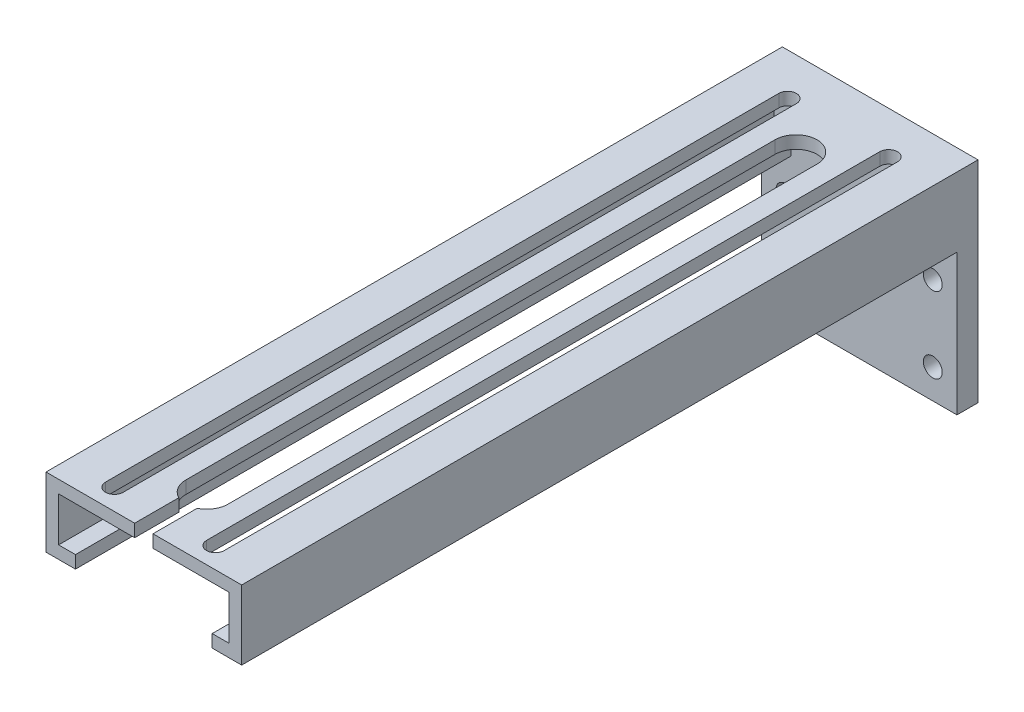
ISO-10303-21;
HEADER;
FILE_DESCRIPTION(('STEP AP214'),'2;1');
FILE_NAME('part.step','',(''),(''),'','','');
FILE_SCHEMA(('AUTOMOTIVE_DESIGN { 1 0 10303 214 1 1 1 1 }'));
ENDSEC;
DATA;
#1=APPLICATION_CONTEXT('core data for automotive mechanical design processes');
#2=APPLICATION_PROTOCOL_DEFINITION('international standard','automotive_design',2000,#1);
#3=PRODUCT_CONTEXT('',#1,'mechanical');
#4=PRODUCT('Part','Part','',(#3));
#5=PRODUCT_RELATED_PRODUCT_CATEGORY('part','',(#4));
#6=PRODUCT_DEFINITION_FORMATION('','',#4);
#7=PRODUCT_DEFINITION_CONTEXT('part definition',#1,'design');
#8=PRODUCT_DEFINITION('design','',#6,#7);
#9=PRODUCT_DEFINITION_SHAPE('','',#8);
#10=(LENGTH_UNIT() NAMED_UNIT(*) SI_UNIT(.MILLI.,.METRE.));
#11=(NAMED_UNIT(*) PLANE_ANGLE_UNIT() SI_UNIT($,.RADIAN.));
#12=(NAMED_UNIT(*) SI_UNIT($,.STERADIAN.) SOLID_ANGLE_UNIT());
#13=UNCERTAINTY_MEASURE_WITH_UNIT(LENGTH_MEASURE(1.E-05),#10,'distance_accuracy_value','');
#14=(GEOMETRIC_REPRESENTATION_CONTEXT(3) GLOBAL_UNCERTAINTY_ASSIGNED_CONTEXT((#13)) GLOBAL_UNIT_ASSIGNED_CONTEXT((#10,
#11,#12)) REPRESENTATION_CONTEXT('',''));
#15=CARTESIAN_POINT('',(0.,0.,0.));
#16=DIRECTION('',(0.,0.,1.));
#17=DIRECTION('',(1.,0.,0.));
#18=AXIS2_PLACEMENT_3D('',#15,#16,#17);
#19=CARTESIAN_POINT('',(0.,0.,175.));
#20=DIRECTION('',(0.,0.,-1.));
#21=DIRECTION('',(-1.,0.,0.));
#22=AXIS2_PLACEMENT_3D('',#19,#20,#21);
#23=PLANE('',#22);
#24=DIRECTION('',(-1.,0.,0.));
#25=VECTOR('',#24,1.);
#26=CARTESIAN_POINT('',(-23.25,25.,175.));
#27=LINE('',#26,#25);
#28=CARTESIAN_POINT('',(23.25,25.,175.));
#29=VERTEX_POINT('',#28);
#30=CARTESIAN_POINT('',(2.17944947177045,25.,175.));
#31=VERTEX_POINT('',#30);
#32=EDGE_CURVE('E327',#29,#31,#27,.T.);
#33=ORIENTED_EDGE('',*,*,#32,.T.);
#34=DIRECTION('',(0.,1.,0.));
#35=VECTOR('',#34,1.);
#36=CARTESIAN_POINT('',(2.17944947177045,20.,175.));
#37=LINE('',#36,#35);
#38=CARTESIAN_POINT('',(2.17944947177045,22.,175.));
#39=VERTEX_POINT('',#38);
#40=EDGE_CURVE('E501',#39,#31,#37,.T.);
#41=ORIENTED_EDGE('',*,*,#40,.F.);
#42=DIRECTION('',(1.,0.,0.));
#43=VECTOR('',#42,1.);
#44=CARTESIAN_POINT('',(20.25,22.,175.));
#45=LINE('',#44,#43);
#46=CARTESIAN_POINT('',(20.25,22.,175.));
#47=VERTEX_POINT('',#46);
#48=EDGE_CURVE('E312',#39,#47,#45,.T.);
#49=ORIENTED_EDGE('',*,*,#48,.T.);
#50=DIRECTION('',(0.,-1.,0.));
#51=VECTOR('',#50,1.);
#52=CARTESIAN_POINT('',(20.25,11.5,175.));
#53=LINE('',#52,#51);
#54=CARTESIAN_POINT('',(20.25,11.5,175.));
#55=VERTEX_POINT('',#54);
#56=EDGE_CURVE('E316',#47,#55,#53,.T.);
#57=ORIENTED_EDGE('',*,*,#56,.T.);
#58=DIRECTION('',(-1.,0.,0.));
#59=VECTOR('',#58,1.);
#60=CARTESIAN_POINT('',(16.25,11.5,175.));
#61=LINE('',#60,#59);
#62=CARTESIAN_POINT('',(16.25,11.5,175.));
#63=VERTEX_POINT('',#62);
#64=EDGE_CURVE('E318',#55,#63,#61,.T.);
#65=ORIENTED_EDGE('',*,*,#64,.T.);
#66=DIRECTION('',(0.,-1.,0.));
#67=VECTOR('',#66,1.);
#68=CARTESIAN_POINT('',(16.25,8.49999999999999,175.));
#69=LINE('',#68,#67);
#70=CARTESIAN_POINT('',(16.25,8.49999999999999,175.));
#71=VERTEX_POINT('',#70);
#72=EDGE_CURVE('E320',#63,#71,#69,.T.);
#73=ORIENTED_EDGE('',*,*,#72,.T.);
#74=DIRECTION('',(1.,0.,0.));
#75=VECTOR('',#74,1.);
#76=CARTESIAN_POINT('',(23.25,8.49999999999999,175.));
#77=LINE('',#76,#75);
#78=CARTESIAN_POINT('',(23.25,8.49999999999999,175.));
#79=VERTEX_POINT('',#78);
#80=EDGE_CURVE('E322',#71,#79,#77,.T.);
#81=ORIENTED_EDGE('',*,*,#80,.T.);
#82=DIRECTION('',(0.,1.,0.));
#83=VECTOR('',#82,1.);
#84=CARTESIAN_POINT('',(23.25,25.,175.));
#85=LINE('',#84,#83);
#86=EDGE_CURVE('E324',#79,#29,#85,.T.);
#87=ORIENTED_EDGE('',*,*,#86,.T.);
#88=EDGE_LOOP('',(#33,#41,#49,#57,#65,#73,#81,#87));
#89=FACE_BOUND('',#88,.T.);
#90=ADVANCED_FACE('F43',(#89),#23,.F.);
#91=CARTESIAN_POINT('',(0.,-25.001,160.));
#92=DIRECTION('',(0.,1.,0.));
#93=DIRECTION('',(-1.,0.,0.));
#94=AXIS2_PLACEMENT_3D('',#91,#92,#93);
#95=CYLINDRICAL_SURFACE('',#94,5.);
#96=CARTESIAN_POINT('',(0.,25.,160.));
#97=DIRECTION('',(0.,1.,0.));
#98=DIRECTION('',(-1.,0.,0.));
#99=AXIS2_PLACEMENT_3D('',#96,#97,#98);
#100=CIRCLE('',#99,5.);
#101=CARTESIAN_POINT('',(-5.,25.,160.));
#102=VERTEX_POINT('',#101);
#103=CARTESIAN_POINT('',(-2.17944947177045,25.,164.5));
#104=VERTEX_POINT('',#103);
#105=EDGE_CURVE('E249',#102,#104,#100,.T.);
#106=ORIENTED_EDGE('',*,*,#105,.T.);
#107=DIRECTION('',(0.,1.,0.));
#108=VECTOR('',#107,1.);
#109=CARTESIAN_POINT('',(-2.17944947177044,-25.001,164.5));
#110=LINE('',#109,#108);
#111=CARTESIAN_POINT('',(-2.17944947177045,22.,164.5));
#112=VERTEX_POINT('',#111);
#113=EDGE_CURVE('E11',#104,#112,#110,.F.);
#114=ORIENTED_EDGE('',*,*,#113,.T.);
#115=CARTESIAN_POINT('',(0.,22.,160.));
#116=DIRECTION('',(0.,1.,0.));
#117=DIRECTION('',(-1.,0.,0.));
#118=AXIS2_PLACEMENT_3D('',#115,#116,#117);
#119=CIRCLE('',#118,5.);
#120=CARTESIAN_POINT('',(-5.,22.,160.));
#121=VERTEX_POINT('',#120);
#122=EDGE_CURVE('E258',#112,#121,#119,.F.);
#123=ORIENTED_EDGE('',*,*,#122,.T.);
#124=DIRECTION('',(0.,1.,0.));
#125=VECTOR('',#124,1.);
#126=CARTESIAN_POINT('',(-5.,-25.001,160.));
#127=LINE('',#126,#125);
#128=EDGE_CURVE('E256',#121,#102,#127,.T.);
#129=ORIENTED_EDGE('',*,*,#128,.T.);
#130=EDGE_LOOP('',(#106,#114,#123,#129));
#131=FACE_BOUND('',#130,.T.);
#132=ADVANCED_FACE('F254',(#131),#95,.F.);
#133=CARTESIAN_POINT('',(-23.25,-25.,5.));
#134=DIRECTION('',(1.,0.,0.));
#135=DIRECTION('',(0.,0.,-1.));
#136=AXIS2_PLACEMENT_3D('',#133,#134,#135);
#137=PLANE('',#136);
#138=DIRECTION('',(0.,-1.,0.));
#139=VECTOR('',#138,1.);
#140=CARTESIAN_POINT('',(-23.25,-25.,0.));
#141=LINE('',#140,#139);
#142=CARTESIAN_POINT('',(-23.25,25.,0.));
#143=VERTEX_POINT('',#142);
#144=CARTESIAN_POINT('',(-23.25,-25.,0.));
#145=VERTEX_POINT('',#144);
#146=EDGE_CURVE('E385',#143,#145,#141,.T.);
#147=ORIENTED_EDGE('',*,*,#146,.T.);
#148=DIRECTION('',(0.,0.,-1.));
#149=VECTOR('',#148,1.);
#150=CARTESIAN_POINT('',(-23.25,-25.,5.));
#151=LINE('',#150,#149);
#152=CARTESIAN_POINT('',(-23.25,-25.,5.));
#153=VERTEX_POINT('',#152);
#154=EDGE_CURVE('E409',#153,#145,#151,.T.);
#155=ORIENTED_EDGE('',*,*,#154,.F.);
#156=DIRECTION('',(0.,-1.,0.));
#157=VECTOR('',#156,1.);
#158=CARTESIAN_POINT('',(-23.25,-25.,5.));
#159=LINE('',#158,#157);
#160=CARTESIAN_POINT('',(-23.25,8.49999999999999,5.));
#161=VERTEX_POINT('',#160);
#162=EDGE_CURVE('E386',#161,#153,#159,.T.);
#163=ORIENTED_EDGE('',*,*,#162,.F.);
#164=DIRECTION('',(0.,0.,-1.));
#165=VECTOR('',#164,1.);
#166=CARTESIAN_POINT('',(-23.25,8.49999999999999,175.));
#167=LINE('',#166,#165);
#168=CARTESIAN_POINT('',(-23.25,8.49999999999999,175.));
#169=VERTEX_POINT('',#168);
#170=EDGE_CURVE('E382',#169,#161,#167,.T.);
#171=ORIENTED_EDGE('',*,*,#170,.F.);
#172=DIRECTION('',(0.,-1.,0.));
#173=VECTOR('',#172,1.);
#174=CARTESIAN_POINT('',(-23.25,8.49999999999999,175.));
#175=LINE('',#174,#173);
#176=CARTESIAN_POINT('',(-23.25,25.,175.));
#177=VERTEX_POINT('',#176);
#178=EDGE_CURVE('E300',#177,#169,#175,.T.);
#179=ORIENTED_EDGE('',*,*,#178,.F.);
#180=DIRECTION('',(0.,0.,-1.));
#181=VECTOR('',#180,1.);
#182=CARTESIAN_POINT('',(-23.25,25.,5.));
#183=LINE('',#182,#181);
#184=EDGE_CURVE('E393',#177,#143,#183,.T.);
#185=ORIENTED_EDGE('',*,*,#184,.T.);
#186=EDGE_LOOP('',(#147,#155,#163,#171,#179,#185));
#187=FACE_BOUND('',#186,.T.);
#188=ADVANCED_FACE('F45',(#187),#137,.F.);
#189=CARTESIAN_POINT('',(23.25,-25.,5.));
#190=DIRECTION('',(0.,1.,0.));
#191=DIRECTION('',(-1.,0.,0.));
#192=AXIS2_PLACEMENT_3D('',#189,#190,#191);
#193=PLANE('',#192);
#194=DIRECTION('',(1.,0.,0.));
#195=VECTOR('',#194,1.);
#196=CARTESIAN_POINT('',(23.25,-25.,0.));
#197=LINE('',#196,#195);
#198=CARTESIAN_POINT('',(23.25,-25.,0.));
#199=VERTEX_POINT('',#198);
#200=EDGE_CURVE('E396',#145,#199,#197,.T.);
#201=ORIENTED_EDGE('',*,*,#200,.T.);
#202=DIRECTION('',(0.,0.,-1.));
#203=VECTOR('',#202,1.);
#204=CARTESIAN_POINT('',(23.25,-25.,5.));
#205=LINE('',#204,#203);
#206=CARTESIAN_POINT('',(23.25,-25.,5.));
#207=VERTEX_POINT('',#206);
#208=EDGE_CURVE('E406',#207,#199,#205,.T.);
#209=ORIENTED_EDGE('',*,*,#208,.F.);
#210=DIRECTION('',(1.,0.,0.));
#211=VECTOR('',#210,1.);
#212=CARTESIAN_POINT('',(23.25,-25.,5.));
#213=LINE('',#212,#211);
#214=EDGE_CURVE('E388',#153,#207,#213,.T.);
#215=ORIENTED_EDGE('',*,*,#214,.F.);
#216=ORIENTED_EDGE('',*,*,#154,.T.);
#217=EDGE_LOOP('',(#201,#209,#215,#216));
#218=FACE_BOUND('',#217,.T.);
#219=ADVANCED_FACE('F619',(#218),#193,.F.);
#220=CARTESIAN_POINT('',(23.25,-25.,5.));
#221=DIRECTION('',(-1.,0.,0.));
#222=DIRECTION('',(0.,0.,1.));
#223=AXIS2_PLACEMENT_3D('',#220,#221,#222);
#224=PLANE('',#223);
#225=DIRECTION('',(0.,1.,0.));
#226=VECTOR('',#225,1.);
#227=CARTESIAN_POINT('',(23.25,-25.,0.));
#228=LINE('',#227,#226);
#229=CARTESIAN_POINT('',(23.25,25.,0.));
#230=VERTEX_POINT('',#229);
#231=EDGE_CURVE('E398',#199,#230,#228,.T.);
#232=ORIENTED_EDGE('',*,*,#231,.T.);
#233=DIRECTION('',(0.,0.,-1.));
#234=VECTOR('',#233,1.);
#235=CARTESIAN_POINT('',(23.25,25.,5.));
#236=LINE('',#235,#234);
#237=EDGE_CURVE('E403',#29,#230,#236,.T.);
#238=ORIENTED_EDGE('',*,*,#237,.F.);
#239=ORIENTED_EDGE('',*,*,#86,.F.);
#240=DIRECTION('',(0.,0.,-1.));
#241=VECTOR('',#240,1.);
#242=CARTESIAN_POINT('',(23.25,8.49999999999999,175.));
#243=LINE('',#242,#241);
#244=CARTESIAN_POINT('',(23.25,8.49999999999999,5.));
#245=VERTEX_POINT('',#244);
#246=EDGE_CURVE('E330',#79,#245,#243,.T.);
#247=ORIENTED_EDGE('',*,*,#246,.T.);
#248=DIRECTION('',(0.,1.,0.));
#249=VECTOR('',#248,1.);
#250=CARTESIAN_POINT('',(23.25,-25.,5.));
#251=LINE('',#250,#249);
#252=EDGE_CURVE('E391',#207,#245,#251,.T.);
#253=ORIENTED_EDGE('',*,*,#252,.F.);
#254=ORIENTED_EDGE('',*,*,#208,.T.);
#255=EDGE_LOOP('',(#232,#238,#239,#247,#253,#254));
#256=FACE_BOUND('',#255,.T.);
#257=ADVANCED_FACE('F616',(#256),#224,.F.);
#258=CARTESIAN_POINT('',(23.25,25.,5.));
#259=DIRECTION('',(0.,-1.,0.));
#260=DIRECTION('',(1.,0.,0.));
#261=AXIS2_PLACEMENT_3D('',#258,#259,#260);
#262=PLANE('',#261);
#263=DIRECTION('',(0.,0.,1.));
#264=VECTOR('',#263,1.);
#265=CARTESIAN_POINT('',(9.9,25.,10.));
#266=LINE('',#265,#264);
#267=CARTESIAN_POINT('',(9.9,25.,10.));
#268=VERTEX_POINT('',#267);
#269=CARTESIAN_POINT('',(9.90000000000001,25.,170.));
#270=VERTEX_POINT('',#269);
#271=EDGE_CURVE('E487',#268,#270,#266,.T.);
#272=ORIENTED_EDGE('',*,*,#271,.F.);
#273=CARTESIAN_POINT('',(12.,25.,10.));
#274=DIRECTION('',(0.,1.,0.));
#275=DIRECTION('',(-1.,0.,0.));
#276=AXIS2_PLACEMENT_3D('',#273,#274,#275);
#277=CIRCLE('',#276,2.1);
#278=CARTESIAN_POINT('',(14.1,25.,10.));
#279=VERTEX_POINT('',#278);
#280=EDGE_CURVE('E490',#279,#268,#277,.T.);
#281=ORIENTED_EDGE('',*,*,#280,.F.);
#282=DIRECTION('',(0.,0.,-1.));
#283=VECTOR('',#282,1.);
#284=CARTESIAN_POINT('',(14.1,25.,10.));
#285=LINE('',#284,#283);
#286=CARTESIAN_POINT('',(14.1,25.,170.));
#287=VERTEX_POINT('',#286);
#288=EDGE_CURVE('E477',#287,#279,#285,.T.);
#289=ORIENTED_EDGE('',*,*,#288,.F.);
#290=CARTESIAN_POINT('',(12.,25.,170.));
#291=DIRECTION('',(0.,1.,0.));
#292=DIRECTION('',(-1.,0.,0.));
#293=AXIS2_PLACEMENT_3D('',#290,#291,#292);
#294=CIRCLE('',#293,2.1);
#295=EDGE_CURVE('E484',#270,#287,#294,.T.);
#296=ORIENTED_EDGE('',*,*,#295,.F.);
#297=EDGE_LOOP('',(#272,#281,#289,#296));
#298=FACE_BOUND('',#297,.T.);
#299=DIRECTION('',(0.,0.,1.));
#300=VECTOR('',#299,1.);
#301=CARTESIAN_POINT('',(-14.1,25.,10.));
#302=LINE('',#301,#300);
#303=CARTESIAN_POINT('',(-14.1,25.,10.));
#304=VERTEX_POINT('',#303);
#305=CARTESIAN_POINT('',(-14.1,25.,170.));
#306=VERTEX_POINT('',#305);
#307=EDGE_CURVE('E450',#304,#306,#302,.T.);
#308=ORIENTED_EDGE('',*,*,#307,.F.);
#309=CARTESIAN_POINT('',(-12.,25.,10.));
#310=DIRECTION('',(0.,1.,0.));
#311=DIRECTION('',(-1.,0.,0.));
#312=AXIS2_PLACEMENT_3D('',#309,#310,#311);
#313=CIRCLE('',#312,2.1);
#314=CARTESIAN_POINT('',(-9.9,25.,10.));
#315=VERTEX_POINT('',#314);
#316=EDGE_CURVE('E448',#315,#304,#313,.T.);
#317=ORIENTED_EDGE('',*,*,#316,.F.);
#318=DIRECTION('',(0.,0.,-1.));
#319=VECTOR('',#318,1.);
#320=CARTESIAN_POINT('',(-9.9,25.,10.));
#321=LINE('',#320,#319);
#322=CARTESIAN_POINT('',(-9.90000000000002,25.,170.));
#323=VERTEX_POINT('',#322);
#324=EDGE_CURVE('E456',#323,#315,#321,.T.);
#325=ORIENTED_EDGE('',*,*,#324,.F.);
#326=CARTESIAN_POINT('',(-12.,25.,170.));
#327=DIRECTION('',(0.,1.,0.));
#328=DIRECTION('',(-1.,0.,0.));
#329=AXIS2_PLACEMENT_3D('',#326,#327,#328);
#330=CIRCLE('',#329,2.1);
#331=EDGE_CURVE('E453',#306,#323,#330,.T.);
#332=ORIENTED_EDGE('',*,*,#331,.F.);
#333=EDGE_LOOP('',(#308,#317,#325,#332));
#334=FACE_BOUND('',#333,.T.);
#335=CARTESIAN_POINT('',(2.17944947177044,25.,164.5));
#336=VERTEX_POINT('',#335);
#337=CARTESIAN_POINT('',(5.,25.,160.));
#338=VERTEX_POINT('',#337);
#339=EDGE_CURVE('E259',#336,#338,#100,.T.);
#340=ORIENTED_EDGE('',*,*,#339,.F.);
#341=DIRECTION('',(0.,0.,-1.));
#342=VECTOR('',#341,1.);
#343=CARTESIAN_POINT('',(2.17944947177045,25.,175.));
#344=LINE('',#343,#342);
#345=EDGE_CURVE('E58',#31,#336,#344,.T.);
#346=ORIENTED_EDGE('',*,*,#345,.F.);
#347=ORIENTED_EDGE('',*,*,#32,.F.);
#348=ORIENTED_EDGE('',*,*,#237,.T.);
#349=DIRECTION('',(-1.,0.,0.));
#350=VECTOR('',#349,1.);
#351=CARTESIAN_POINT('',(23.25,25.,0.));
#352=LINE('',#351,#350);
#353=EDGE_CURVE('E389',#230,#143,#352,.T.);
#354=ORIENTED_EDGE('',*,*,#353,.T.);
#355=ORIENTED_EDGE('',*,*,#184,.F.);
#356=CARTESIAN_POINT('',(-2.17944947177045,25.,175.));
#357=VERTEX_POINT('',#356);
#358=EDGE_CURVE('E251',#357,#177,#27,.T.);
#359=ORIENTED_EDGE('',*,*,#358,.F.);
#360=DIRECTION('',(0.,0.,1.));
#361=VECTOR('',#360,1.);
#362=CARTESIAN_POINT('',(-2.17944947177045,25.,175.));
#363=LINE('',#362,#361);
#364=EDGE_CURVE('E238',#104,#357,#363,.T.);
#365=ORIENTED_EDGE('',*,*,#364,.F.);
#366=ORIENTED_EDGE('',*,*,#105,.F.);
#367=DIRECTION('',(0.,0.,1.));
#368=VECTOR('',#367,1.);
#369=CARTESIAN_POINT('',(-5.,25.,160.));
#370=LINE('',#369,#368);
#371=CARTESIAN_POINT('',(-5.,25.,20.));
#372=VERTEX_POINT('',#371);
#373=EDGE_CURVE('E424',#372,#102,#370,.T.);
#374=ORIENTED_EDGE('',*,*,#373,.F.);
#375=CARTESIAN_POINT('',(0.,25.,20.));
#376=DIRECTION('',(0.,1.,0.));
#377=DIRECTION('',(-1.,0.,0.));
#378=AXIS2_PLACEMENT_3D('',#375,#376,#377);
#379=CIRCLE('',#378,5.);
#380=CARTESIAN_POINT('',(5.,25.,20.));
#381=VERTEX_POINT('',#380);
#382=EDGE_CURVE('E421',#381,#372,#379,.T.);
#383=ORIENTED_EDGE('',*,*,#382,.F.);
#384=DIRECTION('',(0.,0.,-1.));
#385=VECTOR('',#384,1.);
#386=CARTESIAN_POINT('',(5.,25.,160.));
#387=LINE('',#386,#385);
#388=EDGE_CURVE('E263',#338,#381,#387,.T.);
#389=ORIENTED_EDGE('',*,*,#388,.F.);
#390=EDGE_LOOP('',(#340,#346,#347,#348,#354,#355,#359,#365,#366,#374,#383,#389));
#391=FACE_BOUND('',#390,.T.);
#392=ADVANCED_FACE('F247',(#298,#334,#391),#262,.F.);
#393=CARTESIAN_POINT('',(0.,0.,5.));
#394=DIRECTION('',(0.,0.,1.));
#395=DIRECTION('',(1.,0.,0.));
#396=AXIS2_PLACEMENT_3D('',#393,#394,#395);
#397=PLANE('',#396);
#398=CARTESIAN_POINT('',(-17.5,-18.,5.));
#399=DIRECTION('',(0.,0.,1.));
#400=DIRECTION('',(1.,0.,0.));
#401=AXIS2_PLACEMENT_3D('',#398,#399,#400);
#402=CIRCLE('',#401,2.25);
#403=CARTESIAN_POINT('',(-15.25,-18.,5.));
#404=VERTEX_POINT('',#403);
#405=EDGE_CURVE('E274',#404,#404,#402,.T.);
#406=ORIENTED_EDGE('',*,*,#405,.F.);
#407=EDGE_LOOP('',(#406));
#408=FACE_BOUND('',#407,.T.);
#409=CARTESIAN_POINT('',(17.5,0.,5.));
#410=DIRECTION('',(0.,0.,1.));
#411=DIRECTION('',(1.,0.,0.));
#412=AXIS2_PLACEMENT_3D('',#409,#410,#411);
#413=CIRCLE('',#412,2.25);
#414=CARTESIAN_POINT('',(19.75,0.,5.));
#415=VERTEX_POINT('',#414);
#416=EDGE_CURVE('E281',#415,#415,#413,.T.);
#417=ORIENTED_EDGE('',*,*,#416,.F.);
#418=EDGE_LOOP('',(#417));
#419=FACE_BOUND('',#418,.T.);
#420=CARTESIAN_POINT('',(-17.5,0.,5.));
#421=DIRECTION('',(0.,0.,1.));
#422=DIRECTION('',(1.,0.,0.));
#423=AXIS2_PLACEMENT_3D('',#420,#421,#422);
#424=CIRCLE('',#423,2.25);
#425=CARTESIAN_POINT('',(-15.25,0.,5.));
#426=VERTEX_POINT('',#425);
#427=EDGE_CURVE('E287',#426,#426,#424,.T.);
#428=ORIENTED_EDGE('',*,*,#427,.F.);
#429=EDGE_LOOP('',(#428));
#430=FACE_BOUND('',#429,.T.);
#431=CARTESIAN_POINT('',(17.5,-18.,5.));
#432=DIRECTION('',(0.,0.,1.));
#433=DIRECTION('',(1.,0.,0.));
#434=AXIS2_PLACEMENT_3D('',#431,#432,#433);
#435=CIRCLE('',#434,2.25);
#436=CARTESIAN_POINT('',(19.75,-18.,5.));
#437=VERTEX_POINT('',#436);
#438=EDGE_CURVE('E293',#437,#437,#435,.T.);
#439=ORIENTED_EDGE('',*,*,#438,.F.);
#440=EDGE_LOOP('',(#439));
#441=FACE_BOUND('',#440,.T.);
#442=DIRECTION('',(1.,0.,0.));
#443=VECTOR('',#442,1.);
#444=CARTESIAN_POINT('',(23.25,8.49999999999999,5.));
#445=LINE('',#444,#443);
#446=CARTESIAN_POINT('',(16.25,8.49999999999999,5.));
#447=VERTEX_POINT('',#446);
#448=EDGE_CURVE('E304',#447,#245,#445,.T.);
#449=ORIENTED_EDGE('',*,*,#448,.F.);
#450=DIRECTION('',(0.,-1.,0.));
#451=VECTOR('',#450,1.);
#452=CARTESIAN_POINT('',(16.25,8.49999999999999,5.));
#453=LINE('',#452,#451);
#454=CARTESIAN_POINT('',(16.25,11.5,5.));
#455=VERTEX_POINT('',#454);
#456=EDGE_CURVE('E351',#455,#447,#453,.T.);
#457=ORIENTED_EDGE('',*,*,#456,.F.);
#458=DIRECTION('',(-1.,0.,0.));
#459=VECTOR('',#458,1.);
#460=CARTESIAN_POINT('',(16.25,11.5,5.));
#461=LINE('',#460,#459);
#462=CARTESIAN_POINT('',(20.25,11.5,5.));
#463=VERTEX_POINT('',#462);
#464=EDGE_CURVE('E348',#463,#455,#461,.T.);
#465=ORIENTED_EDGE('',*,*,#464,.F.);
#466=DIRECTION('',(0.,-1.,0.));
#467=VECTOR('',#466,1.);
#468=CARTESIAN_POINT('',(20.25,11.5,5.));
#469=LINE('',#468,#467);
#470=CARTESIAN_POINT('',(20.25,22.,5.));
#471=VERTEX_POINT('',#470);
#472=EDGE_CURVE('E345',#471,#463,#469,.T.);
#473=ORIENTED_EDGE('',*,*,#472,.F.);
#474=DIRECTION('',(1.,0.,0.));
#475=VECTOR('',#474,1.);
#476=CARTESIAN_POINT('',(20.25,22.,5.));
#477=LINE('',#476,#475);
#478=CARTESIAN_POINT('',(-20.25,22.,5.));
#479=VERTEX_POINT('',#478);
#480=EDGE_CURVE('E342',#479,#471,#477,.T.);
#481=ORIENTED_EDGE('',*,*,#480,.F.);
#482=DIRECTION('',(0.,1.,0.));
#483=VECTOR('',#482,1.);
#484=CARTESIAN_POINT('',(-20.25,22.,5.));
#485=LINE('',#484,#483);
#486=CARTESIAN_POINT('',(-20.25,11.5,5.));
#487=VERTEX_POINT('',#486);
#488=EDGE_CURVE('E339',#487,#479,#485,.T.);
#489=ORIENTED_EDGE('',*,*,#488,.F.);
#490=DIRECTION('',(-1.,0.,0.));
#491=VECTOR('',#490,1.);
#492=CARTESIAN_POINT('',(-20.25,11.5,5.));
#493=LINE('',#492,#491);
#494=CARTESIAN_POINT('',(-16.25,11.5,5.));
#495=VERTEX_POINT('',#494);
#496=EDGE_CURVE('E336',#495,#487,#493,.T.);
#497=ORIENTED_EDGE('',*,*,#496,.F.);
#498=DIRECTION('',(0.,1.,0.));
#499=VECTOR('',#498,1.);
#500=CARTESIAN_POINT('',(-16.25,11.5,5.));
#501=LINE('',#500,#499);
#502=CARTESIAN_POINT('',(-16.25,8.49999999999999,5.));
#503=VERTEX_POINT('',#502);
#504=EDGE_CURVE('E333',#503,#495,#501,.T.);
#505=ORIENTED_EDGE('',*,*,#504,.F.);
#506=DIRECTION('',(1.,0.,0.));
#507=VECTOR('',#506,1.);
#508=CARTESIAN_POINT('',(-16.25,8.49999999999999,5.));
#509=LINE('',#508,#507);
#510=EDGE_CURVE('E299',#161,#503,#509,.T.);
#511=ORIENTED_EDGE('',*,*,#510,.F.);
#512=ORIENTED_EDGE('',*,*,#162,.T.);
#513=ORIENTED_EDGE('',*,*,#214,.T.);
#514=ORIENTED_EDGE('',*,*,#252,.T.);
#515=EDGE_LOOP('',(#449,#457,#465,#473,#481,#489,#497,#505,#511,#512,#513,#514));
#516=FACE_BOUND('',#515,.T.);
#517=ADVANCED_FACE('F608',(#408,#419,#430,#441,#516),#397,.T.);
#518=CARTESIAN_POINT('',(0.,0.,0.));
#519=DIRECTION('',(0.,0.,1.));
#520=DIRECTION('',(1.,0.,0.));
#521=AXIS2_PLACEMENT_3D('',#518,#519,#520);
#522=PLANE('',#521);
#523=CARTESIAN_POINT('',(-17.5,-18.,0.));
#524=DIRECTION('',(0.,0.,1.));
#525=DIRECTION('',(1.,0.,0.));
#526=AXIS2_PLACEMENT_3D('',#523,#524,#525);
#527=CIRCLE('',#526,2.25);
#528=CARTESIAN_POINT('',(-15.25,-18.,0.));
#529=VERTEX_POINT('',#528);
#530=EDGE_CURVE('E277',#529,#529,#527,.T.);
#531=ORIENTED_EDGE('',*,*,#530,.T.);
#532=EDGE_LOOP('',(#531));
#533=FACE_BOUND('',#532,.T.);
#534=CARTESIAN_POINT('',(17.5,0.,0.));
#535=DIRECTION('',(0.,0.,1.));
#536=DIRECTION('',(1.,0.,0.));
#537=AXIS2_PLACEMENT_3D('',#534,#535,#536);
#538=CIRCLE('',#537,2.25);
#539=CARTESIAN_POINT('',(19.75,0.,0.));
#540=VERTEX_POINT('',#539);
#541=EDGE_CURVE('E284',#540,#540,#538,.T.);
#542=ORIENTED_EDGE('',*,*,#541,.T.);
#543=EDGE_LOOP('',(#542));
#544=FACE_BOUND('',#543,.T.);
#545=CARTESIAN_POINT('',(-17.5,0.,0.));
#546=DIRECTION('',(0.,0.,1.));
#547=DIRECTION('',(1.,0.,0.));
#548=AXIS2_PLACEMENT_3D('',#545,#546,#547);
#549=CIRCLE('',#548,2.25);
#550=CARTESIAN_POINT('',(-15.25,0.,0.));
#551=VERTEX_POINT('',#550);
#552=EDGE_CURVE('E290',#551,#551,#549,.T.);
#553=ORIENTED_EDGE('',*,*,#552,.T.);
#554=EDGE_LOOP('',(#553));
#555=FACE_BOUND('',#554,.T.);
#556=CARTESIAN_POINT('',(17.5,-18.,0.));
#557=DIRECTION('',(0.,0.,1.));
#558=DIRECTION('',(1.,0.,0.));
#559=AXIS2_PLACEMENT_3D('',#556,#557,#558);
#560=CIRCLE('',#559,2.25);
#561=CARTESIAN_POINT('',(19.75,-18.,0.));
#562=VERTEX_POINT('',#561);
#563=EDGE_CURVE('E296',#562,#562,#560,.T.);
#564=ORIENTED_EDGE('',*,*,#563,.T.);
#565=EDGE_LOOP('',(#564));
#566=FACE_BOUND('',#565,.T.);
#567=ORIENTED_EDGE('',*,*,#146,.F.);
#568=ORIENTED_EDGE('',*,*,#353,.F.);
#569=ORIENTED_EDGE('',*,*,#231,.F.);
#570=ORIENTED_EDGE('',*,*,#200,.F.);
#571=EDGE_LOOP('',(#567,#568,#569,#570));
#572=FACE_BOUND('',#571,.T.);
#573=ADVANCED_FACE('F533',(#533,#544,#555,#566,#572),#522,.F.);
#574=CARTESIAN_POINT('',(-16.25,8.49999999999999,175.));
#575=DIRECTION('',(0.,1.,0.));
#576=DIRECTION('',(-1.,0.,0.));
#577=AXIS2_PLACEMENT_3D('',#574,#575,#576);
#578=PLANE('',#577);
#579=ORIENTED_EDGE('',*,*,#510,.T.);
#580=DIRECTION('',(0.,0.,-1.));
#581=VECTOR('',#580,1.);
#582=CARTESIAN_POINT('',(-16.25,8.49999999999999,175.));
#583=LINE('',#582,#581);
#584=CARTESIAN_POINT('',(-16.25,8.49999999999999,175.));
#585=VERTEX_POINT('',#584);
#586=EDGE_CURVE('E379',#585,#503,#583,.T.);
#587=ORIENTED_EDGE('',*,*,#586,.F.);
#588=DIRECTION('',(1.,0.,0.));
#589=VECTOR('',#588,1.);
#590=CARTESIAN_POINT('',(-16.25,8.49999999999999,175.));
#591=LINE('',#590,#589);
#592=EDGE_CURVE('E303',#169,#585,#591,.T.);
#593=ORIENTED_EDGE('',*,*,#592,.F.);
#594=ORIENTED_EDGE('',*,*,#170,.T.);
#595=EDGE_LOOP('',(#579,#587,#593,#594));
#596=FACE_BOUND('',#595,.T.);
#597=ADVANCED_FACE('F603',(#596),#578,.F.);
#598=CARTESIAN_POINT('',(-16.25,11.5,175.));
#599=DIRECTION('',(-1.,0.,0.));
#600=DIRECTION('',(0.,0.,1.));
#601=AXIS2_PLACEMENT_3D('',#598,#599,#600);
#602=PLANE('',#601);
#603=ORIENTED_EDGE('',*,*,#504,.T.);
#604=DIRECTION('',(0.,0.,-1.));
#605=VECTOR('',#604,1.);
#606=CARTESIAN_POINT('',(-16.25,11.5,175.));
#607=LINE('',#606,#605);
#608=CARTESIAN_POINT('',(-16.25,11.5,175.));
#609=VERTEX_POINT('',#608);
#610=EDGE_CURVE('E376',#609,#495,#607,.T.);
#611=ORIENTED_EDGE('',*,*,#610,.F.);
#612=DIRECTION('',(0.,1.,0.));
#613=VECTOR('',#612,1.);
#614=CARTESIAN_POINT('',(-16.25,11.5,175.));
#615=LINE('',#614,#613);
#616=EDGE_CURVE('E306',#585,#609,#615,.T.);
#617=ORIENTED_EDGE('',*,*,#616,.F.);
#618=ORIENTED_EDGE('',*,*,#586,.T.);
#619=EDGE_LOOP('',(#603,#611,#617,#618));
#620=FACE_BOUND('',#619,.T.);
#621=ADVANCED_FACE('F599',(#620),#602,.F.);
#622=CARTESIAN_POINT('',(-20.25,11.5,175.));
#623=DIRECTION('',(0.,-1.,0.));
#624=DIRECTION('',(0.,0.,-1.));
#625=AXIS2_PLACEMENT_3D('',#622,#623,#624);
#626=PLANE('',#625);
#627=ORIENTED_EDGE('',*,*,#496,.T.);
#628=DIRECTION('',(0.,0.,-1.));
#629=VECTOR('',#628,1.);
#630=CARTESIAN_POINT('',(-20.25,11.5,175.));
#631=LINE('',#630,#629);
#632=CARTESIAN_POINT('',(-20.25,11.5,175.));
#633=VERTEX_POINT('',#632);
#634=EDGE_CURVE('E373',#633,#487,#631,.T.);
#635=ORIENTED_EDGE('',*,*,#634,.F.);
#636=DIRECTION('',(-1.,0.,0.));
#637=VECTOR('',#636,1.);
#638=CARTESIAN_POINT('',(-20.25,11.5,175.));
#639=LINE('',#638,#637);
#640=EDGE_CURVE('E308',#609,#633,#639,.T.);
#641=ORIENTED_EDGE('',*,*,#640,.F.);
#642=ORIENTED_EDGE('',*,*,#610,.T.);
#643=EDGE_LOOP('',(#627,#635,#641,#642));
#644=FACE_BOUND('',#643,.T.);
#645=ADVANCED_FACE('F595',(#644),#626,.F.);
#646=CARTESIAN_POINT('',(-20.25,22.,175.));
#647=DIRECTION('',(-1.,0.,0.));
#648=DIRECTION('',(0.,0.,1.));
#649=AXIS2_PLACEMENT_3D('',#646,#647,#648);
#650=PLANE('',#649);
#651=ORIENTED_EDGE('',*,*,#488,.T.);
#652=DIRECTION('',(0.,0.,-1.));
#653=VECTOR('',#652,1.);
#654=CARTESIAN_POINT('',(-20.25,22.,175.));
#655=LINE('',#654,#653);
#656=CARTESIAN_POINT('',(-20.25,22.,175.));
#657=VERTEX_POINT('',#656);
#658=EDGE_CURVE('E370',#657,#479,#655,.T.);
#659=ORIENTED_EDGE('',*,*,#658,.F.);
#660=DIRECTION('',(0.,1.,0.));
#661=VECTOR('',#660,1.);
#662=CARTESIAN_POINT('',(-20.25,22.,175.));
#663=LINE('',#662,#661);
#664=EDGE_CURVE('E310',#633,#657,#663,.T.);
#665=ORIENTED_EDGE('',*,*,#664,.F.);
#666=ORIENTED_EDGE('',*,*,#634,.T.);
#667=EDGE_LOOP('',(#651,#659,#665,#666));
#668=FACE_BOUND('',#667,.T.);
#669=ADVANCED_FACE('F591',(#668),#650,.F.);
#670=CARTESIAN_POINT('',(20.25,22.,175.));
#671=DIRECTION('',(0.,1.,0.));
#672=DIRECTION('',(-1.,0.,0.));
#673=AXIS2_PLACEMENT_3D('',#670,#671,#672);
#674=PLANE('',#673);
#675=DIRECTION('',(0.,0.,1.));
#676=VECTOR('',#675,1.);
#677=CARTESIAN_POINT('',(14.1,22.,10.));
#678=LINE('',#677,#676);
#679=CARTESIAN_POINT('',(14.1,22.,10.));
#680=VERTEX_POINT('',#679);
#681=CARTESIAN_POINT('',(14.1,22.,170.));
#682=VERTEX_POINT('',#681);
#683=EDGE_CURVE('E495',#680,#682,#678,.T.);
#684=ORIENTED_EDGE('',*,*,#683,.F.);
#685=CARTESIAN_POINT('',(12.,22.,10.));
#686=DIRECTION('',(0.,1.,0.));
#687=DIRECTION('',(-1.,0.,0.));
#688=AXIS2_PLACEMENT_3D('',#685,#686,#687);
#689=CIRCLE('',#688,2.1);
#690=CARTESIAN_POINT('',(9.9,22.,10.));
#691=VERTEX_POINT('',#690);
#692=EDGE_CURVE('E492',#691,#680,#689,.F.);
#693=ORIENTED_EDGE('',*,*,#692,.F.);
#694=DIRECTION('',(0.,0.,-1.));
#695=VECTOR('',#694,1.);
#696=CARTESIAN_POINT('',(9.9,22.,10.));
#697=LINE('',#696,#695);
#698=CARTESIAN_POINT('',(9.90000000000002,22.,170.));
#699=VERTEX_POINT('',#698);
#700=EDGE_CURVE('E278',#699,#691,#697,.T.);
#701=ORIENTED_EDGE('',*,*,#700,.F.);
#702=CARTESIAN_POINT('',(12.,22.,170.));
#703=DIRECTION('',(0.,1.,0.));
#704=DIRECTION('',(-1.,0.,0.));
#705=AXIS2_PLACEMENT_3D('',#702,#703,#704);
#706=CIRCLE('',#705,2.1);
#707=EDGE_CURVE('E441',#682,#699,#706,.F.);
#708=ORIENTED_EDGE('',*,*,#707,.F.);
#709=EDGE_LOOP('',(#684,#693,#701,#708));
#710=FACE_BOUND('',#709,.T.);
#711=DIRECTION('',(0.,0.,1.));
#712=VECTOR('',#711,1.);
#713=CARTESIAN_POINT('',(-9.9,22.,10.));
#714=LINE('',#713,#712);
#715=CARTESIAN_POINT('',(-9.9,22.,10.));
#716=VERTEX_POINT('',#715);
#717=CARTESIAN_POINT('',(-9.90000000000002,22.,170.));
#718=VERTEX_POINT('',#717);
#719=EDGE_CURVE('E442',#716,#718,#714,.T.);
#720=ORIENTED_EDGE('',*,*,#719,.F.);
#721=CARTESIAN_POINT('',(-12.,22.,10.));
#722=DIRECTION('',(0.,1.,0.));
#723=DIRECTION('',(-1.,0.,0.));
#724=AXIS2_PLACEMENT_3D('',#721,#722,#723);
#725=CIRCLE('',#724,2.1);
#726=CARTESIAN_POINT('',(-14.1,22.,10.));
#727=VERTEX_POINT('',#726);
#728=EDGE_CURVE('E445',#727,#716,#725,.F.);
#729=ORIENTED_EDGE('',*,*,#728,.F.);
#730=DIRECTION('',(0.,0.,-1.));
#731=VECTOR('',#730,1.);
#732=CARTESIAN_POINT('',(-14.1,22.,10.));
#733=LINE('',#732,#731);
#734=CARTESIAN_POINT('',(-14.1,22.,170.));
#735=VERTEX_POINT('',#734);
#736=EDGE_CURVE('E273',#735,#727,#733,.T.);
#737=ORIENTED_EDGE('',*,*,#736,.F.);
#738=CARTESIAN_POINT('',(-12.,22.,170.));
#739=DIRECTION('',(0.,1.,0.));
#740=DIRECTION('',(-1.,0.,0.));
#741=AXIS2_PLACEMENT_3D('',#738,#739,#740);
#742=CIRCLE('',#741,2.1);
#743=EDGE_CURVE('E439',#718,#735,#742,.F.);
#744=ORIENTED_EDGE('',*,*,#743,.F.);
#745=EDGE_LOOP('',(#720,#729,#737,#744));
#746=FACE_BOUND('',#745,.T.);
#747=ORIENTED_EDGE('',*,*,#48,.F.);
#748=DIRECTION('',(0.,0.,-1.));
#749=VECTOR('',#748,1.);
#750=CARTESIAN_POINT('',(2.17944947177045,22.,175.));
#751=LINE('',#750,#749);
#752=CARTESIAN_POINT('',(2.17944947177045,22.,164.5));
#753=VERTEX_POINT('',#752);
#754=EDGE_CURVE('E438',#39,#753,#751,.T.);
#755=ORIENTED_EDGE('',*,*,#754,.T.);
#756=CARTESIAN_POINT('',(5.,22.,160.));
#757=VERTEX_POINT('',#756);
#758=EDGE_CURVE('E261',#757,#753,#119,.F.);
#759=ORIENTED_EDGE('',*,*,#758,.F.);
#760=DIRECTION('',(0.,0.,1.));
#761=VECTOR('',#760,1.);
#762=CARTESIAN_POINT('',(5.,22.,160.));
#763=LINE('',#762,#761);
#764=CARTESIAN_POINT('',(5.,22.,20.));
#765=VERTEX_POINT('',#764);
#766=EDGE_CURVE('E431',#765,#757,#763,.T.);
#767=ORIENTED_EDGE('',*,*,#766,.F.);
#768=CARTESIAN_POINT('',(0.,22.,20.));
#769=DIRECTION('',(0.,1.,0.));
#770=DIRECTION('',(-1.,0.,0.));
#771=AXIS2_PLACEMENT_3D('',#768,#769,#770);
#772=CIRCLE('',#771,5.);
#773=CARTESIAN_POINT('',(-5.,22.,20.));
#774=VERTEX_POINT('',#773);
#775=EDGE_CURVE('E271',#774,#765,#772,.F.);
#776=ORIENTED_EDGE('',*,*,#775,.F.);
#777=DIRECTION('',(0.,0.,-1.));
#778=VECTOR('',#777,1.);
#779=CARTESIAN_POINT('',(-5.,22.,160.));
#780=LINE('',#779,#778);
#781=EDGE_CURVE('E268',#121,#774,#780,.T.);
#782=ORIENTED_EDGE('',*,*,#781,.F.);
#783=ORIENTED_EDGE('',*,*,#122,.F.);
#784=DIRECTION('',(0.,0.,1.));
#785=VECTOR('',#784,1.);
#786=CARTESIAN_POINT('',(-2.17944947177045,22.,175.));
#787=LINE('',#786,#785);
#788=CARTESIAN_POINT('',(-2.17944947177045,22.,175.));
#789=VERTEX_POINT('',#788);
#790=EDGE_CURVE('E66',#112,#789,#787,.T.);
#791=ORIENTED_EDGE('',*,*,#790,.T.);
#792=EDGE_CURVE('E313',#657,#789,#45,.T.);
#793=ORIENTED_EDGE('',*,*,#792,.F.);
#794=ORIENTED_EDGE('',*,*,#658,.T.);
#795=ORIENTED_EDGE('',*,*,#480,.T.);
#796=DIRECTION('',(0.,0.,-1.));
#797=VECTOR('',#796,1.);
#798=CARTESIAN_POINT('',(20.25,22.,175.));
#799=LINE('',#798,#797);
#800=EDGE_CURVE('E367',#47,#471,#799,.T.);
#801=ORIENTED_EDGE('',*,*,#800,.F.);
#802=EDGE_LOOP('',(#747,#755,#759,#767,#776,#782,#783,#791,#793,#794,#795,#801));
#803=FACE_BOUND('',#802,.T.);
#804=ADVANCED_FACE('F510',(#710,#746,#803),#674,.F.);
#805=CARTESIAN_POINT('',(20.25,11.5,175.));
#806=DIRECTION('',(1.,0.,0.));
#807=DIRECTION('',(0.,0.,-1.));
#808=AXIS2_PLACEMENT_3D('',#805,#806,#807);
#809=PLANE('',#808);
#810=ORIENTED_EDGE('',*,*,#472,.T.);
#811=DIRECTION('',(0.,0.,-1.));
#812=VECTOR('',#811,1.);
#813=CARTESIAN_POINT('',(20.25,11.5,175.));
#814=LINE('',#813,#812);
#815=EDGE_CURVE('E364',#55,#463,#814,.T.);
#816=ORIENTED_EDGE('',*,*,#815,.F.);
#817=ORIENTED_EDGE('',*,*,#56,.F.);
#818=ORIENTED_EDGE('',*,*,#800,.T.);
#819=EDGE_LOOP('',(#810,#816,#817,#818));
#820=FACE_BOUND('',#819,.T.);
#821=ADVANCED_FACE('F514',(#820),#809,.F.);
#822=CARTESIAN_POINT('',(16.25,11.5,175.));
#823=DIRECTION('',(0.,-1.,0.));
#824=DIRECTION('',(0.,0.,-1.));
#825=AXIS2_PLACEMENT_3D('',#822,#823,#824);
#826=PLANE('',#825);
#827=ORIENTED_EDGE('',*,*,#464,.T.);
#828=DIRECTION('',(0.,0.,-1.));
#829=VECTOR('',#828,1.);
#830=CARTESIAN_POINT('',(16.25,11.5,175.));
#831=LINE('',#830,#829);
#832=EDGE_CURVE('E361',#63,#455,#831,.T.);
#833=ORIENTED_EDGE('',*,*,#832,.F.);
#834=ORIENTED_EDGE('',*,*,#64,.F.);
#835=ORIENTED_EDGE('',*,*,#815,.T.);
#836=EDGE_LOOP('',(#827,#833,#834,#835));
#837=FACE_BOUND('',#836,.T.);
#838=ADVANCED_FACE('F520',(#837),#826,.F.);
#839=CARTESIAN_POINT('',(16.25,8.49999999999999,175.));
#840=DIRECTION('',(1.,0.,0.));
#841=DIRECTION('',(0.,0.,-1.));
#842=AXIS2_PLACEMENT_3D('',#839,#840,#841);
#843=PLANE('',#842);
#844=ORIENTED_EDGE('',*,*,#456,.T.);
#845=DIRECTION('',(0.,0.,-1.));
#846=VECTOR('',#845,1.);
#847=CARTESIAN_POINT('',(16.25,8.49999999999999,175.));
#848=LINE('',#847,#846);
#849=EDGE_CURVE('E358',#71,#447,#848,.T.);
#850=ORIENTED_EDGE('',*,*,#849,.F.);
#851=ORIENTED_EDGE('',*,*,#72,.F.);
#852=ORIENTED_EDGE('',*,*,#832,.T.);
#853=EDGE_LOOP('',(#844,#850,#851,#852));
#854=FACE_BOUND('',#853,.T.);
#855=ADVANCED_FACE('F522',(#854),#843,.F.);
#856=CARTESIAN_POINT('',(23.25,8.49999999999999,175.));
#857=DIRECTION('',(0.,1.,0.));
#858=DIRECTION('',(-1.,0.,0.));
#859=AXIS2_PLACEMENT_3D('',#856,#857,#858);
#860=PLANE('',#859);
#861=ORIENTED_EDGE('',*,*,#448,.T.);
#862=ORIENTED_EDGE('',*,*,#246,.F.);
#863=ORIENTED_EDGE('',*,*,#80,.F.);
#864=ORIENTED_EDGE('',*,*,#849,.T.);
#865=EDGE_LOOP('',(#861,#862,#863,#864));
#866=FACE_BOUND('',#865,.T.);
#867=ADVANCED_FACE('F526',(#866),#860,.F.);
#868=ORIENTED_EDGE('',*,*,#792,.T.);
#869=DIRECTION('',(0.,1.,0.));
#870=VECTOR('',#869,1.);
#871=CARTESIAN_POINT('',(-2.17944947177045,20.,175.));
#872=LINE('',#871,#870);
#873=EDGE_CURVE('E252',#789,#357,#872,.T.);
#874=ORIENTED_EDGE('',*,*,#873,.T.);
#875=ORIENTED_EDGE('',*,*,#358,.T.);
#876=ORIENTED_EDGE('',*,*,#178,.T.);
#877=ORIENTED_EDGE('',*,*,#592,.T.);
#878=ORIENTED_EDGE('',*,*,#616,.T.);
#879=ORIENTED_EDGE('',*,*,#640,.T.);
#880=ORIENTED_EDGE('',*,*,#664,.T.);
#881=EDGE_LOOP('',(#868,#874,#875,#876,#877,#878,#879,#880));
#882=FACE_BOUND('',#881,.T.);
#883=ADVANCED_FACE('F540',(#882),#23,.F.);
#884=CARTESIAN_POINT('',(17.5,-18.,5.));
#885=DIRECTION('',(0.,0.,1.));
#886=DIRECTION('',(1.,0.,0.));
#887=AXIS2_PLACEMENT_3D('',#884,#885,#886);
#888=CYLINDRICAL_SURFACE('',#887,2.25);
#889=ORIENTED_EDGE('',*,*,#563,.F.);
#890=EDGE_LOOP('',(#889));
#891=FACE_BOUND('',#890,.T.);
#892=ORIENTED_EDGE('',*,*,#438,.T.);
#893=EDGE_LOOP('',(#892));
#894=FACE_BOUND('',#893,.T.);
#895=ADVANCED_FACE('F571',(#891,#894),#888,.F.);
#896=CARTESIAN_POINT('',(-17.5,0.,5.));
#897=DIRECTION('',(0.,0.,1.));
#898=DIRECTION('',(1.,0.,0.));
#899=AXIS2_PLACEMENT_3D('',#896,#897,#898);
#900=CYLINDRICAL_SURFACE('',#899,2.25);
#901=ORIENTED_EDGE('',*,*,#552,.F.);
#902=EDGE_LOOP('',(#901));
#903=FACE_BOUND('',#902,.T.);
#904=ORIENTED_EDGE('',*,*,#427,.T.);
#905=EDGE_LOOP('',(#904));
#906=FACE_BOUND('',#905,.T.);
#907=ADVANCED_FACE('F577',(#903,#906),#900,.F.);
#908=CARTESIAN_POINT('',(17.5,0.,5.));
#909=DIRECTION('',(0.,0.,1.));
#910=DIRECTION('',(1.,0.,0.));
#911=AXIS2_PLACEMENT_3D('',#908,#909,#910);
#912=CYLINDRICAL_SURFACE('',#911,2.25);
#913=ORIENTED_EDGE('',*,*,#541,.F.);
#914=EDGE_LOOP('',(#913));
#915=FACE_BOUND('',#914,.T.);
#916=ORIENTED_EDGE('',*,*,#416,.T.);
#917=EDGE_LOOP('',(#916));
#918=FACE_BOUND('',#917,.T.);
#919=ADVANCED_FACE('F704',(#915,#918),#912,.F.);
#920=CARTESIAN_POINT('',(-17.5,-18.,5.));
#921=DIRECTION('',(0.,0.,1.));
#922=DIRECTION('',(1.,0.,0.));
#923=AXIS2_PLACEMENT_3D('',#920,#921,#922);
#924=CYLINDRICAL_SURFACE('',#923,2.25);
#925=ORIENTED_EDGE('',*,*,#530,.F.);
#926=EDGE_LOOP('',(#925));
#927=FACE_BOUND('',#926,.T.);
#928=ORIENTED_EDGE('',*,*,#405,.T.);
#929=EDGE_LOOP('',(#928));
#930=FACE_BOUND('',#929,.T.);
#931=ADVANCED_FACE('F714',(#927,#930),#924,.F.);
#932=ORIENTED_EDGE('',*,*,#758,.T.);
#933=DIRECTION('',(0.,1.,0.));
#934=VECTOR('',#933,1.);
#935=CARTESIAN_POINT('',(2.17944947177045,-25.001,164.5));
#936=LINE('',#935,#934);
#937=EDGE_CURVE('E51',#753,#336,#936,.T.);
#938=ORIENTED_EDGE('',*,*,#937,.T.);
#939=ORIENTED_EDGE('',*,*,#339,.T.);
#940=DIRECTION('',(0.,1.,0.));
#941=VECTOR('',#940,1.);
#942=CARTESIAN_POINT('',(5.,-25.001,160.));
#943=LINE('',#942,#941);
#944=EDGE_CURVE('E426',#757,#338,#943,.T.);
#945=ORIENTED_EDGE('',*,*,#944,.F.);
#946=EDGE_LOOP('',(#932,#938,#939,#945));
#947=FACE_BOUND('',#946,.T.);
#948=ADVANCED_FACE('F412',(#947),#95,.F.);
#949=CARTESIAN_POINT('',(-5.,-25.001,160.));
#950=DIRECTION('',(-1.,0.,0.));
#951=DIRECTION('',(0.,-1.,0.));
#952=AXIS2_PLACEMENT_3D('',#949,#950,#951);
#953=PLANE('',#952);
#954=ORIENTED_EDGE('',*,*,#781,.T.);
#955=DIRECTION('',(0.,1.,0.));
#956=VECTOR('',#955,1.);
#957=CARTESIAN_POINT('',(-5.,-25.001,20.));
#958=LINE('',#957,#956);
#959=EDGE_CURVE('E430',#774,#372,#958,.T.);
#960=ORIENTED_EDGE('',*,*,#959,.T.);
#961=ORIENTED_EDGE('',*,*,#373,.T.);
#962=ORIENTED_EDGE('',*,*,#128,.F.);
#963=EDGE_LOOP('',(#954,#960,#961,#962));
#964=FACE_BOUND('',#963,.T.);
#965=ADVANCED_FACE('F546',(#964),#953,.F.);
#966=CARTESIAN_POINT('',(0.,-25.001,20.));
#967=DIRECTION('',(0.,1.,0.));
#968=DIRECTION('',(-1.,0.,0.));
#969=AXIS2_PLACEMENT_3D('',#966,#967,#968);
#970=CYLINDRICAL_SURFACE('',#969,5.);
#971=ORIENTED_EDGE('',*,*,#775,.T.);
#972=DIRECTION('',(0.,1.,0.));
#973=VECTOR('',#972,1.);
#974=CARTESIAN_POINT('',(5.,-25.001,20.));
#975=LINE('',#974,#973);
#976=EDGE_CURVE('E433',#765,#381,#975,.T.);
#977=ORIENTED_EDGE('',*,*,#976,.T.);
#978=ORIENTED_EDGE('',*,*,#382,.T.);
#979=ORIENTED_EDGE('',*,*,#959,.F.);
#980=EDGE_LOOP('',(#971,#977,#978,#979));
#981=FACE_BOUND('',#980,.T.);
#982=ADVANCED_FACE('F547',(#981),#970,.F.);
#983=CARTESIAN_POINT('',(5.,-25.001,160.));
#984=DIRECTION('',(1.,0.,0.));
#985=DIRECTION('',(0.,1.,0.));
#986=AXIS2_PLACEMENT_3D('',#983,#984,#985);
#987=PLANE('',#986);
#988=ORIENTED_EDGE('',*,*,#766,.T.);
#989=ORIENTED_EDGE('',*,*,#944,.T.);
#990=ORIENTED_EDGE('',*,*,#388,.T.);
#991=ORIENTED_EDGE('',*,*,#976,.F.);
#992=EDGE_LOOP('',(#988,#989,#990,#991));
#993=FACE_BOUND('',#992,.T.);
#994=ADVANCED_FACE('F549',(#993),#987,.F.);
#995=CARTESIAN_POINT('',(-12.,-25.001,10.));
#996=DIRECTION('',(0.,1.,0.));
#997=DIRECTION('',(-1.,0.,0.));
#998=AXIS2_PLACEMENT_3D('',#995,#996,#997);
#999=CYLINDRICAL_SURFACE('',#998,2.1);
#1000=ORIENTED_EDGE('',*,*,#728,.T.);
#1001=DIRECTION('',(0.,1.,0.));
#1002=VECTOR('',#1001,1.);
#1003=CARTESIAN_POINT('',(-9.9,-25.001,10.));
#1004=LINE('',#1003,#1002);
#1005=EDGE_CURVE('E460',#716,#315,#1004,.T.);
#1006=ORIENTED_EDGE('',*,*,#1005,.T.);
#1007=ORIENTED_EDGE('',*,*,#316,.T.);
#1008=DIRECTION('',(0.,1.,0.));
#1009=VECTOR('',#1008,1.);
#1010=CARTESIAN_POINT('',(-14.1,-25.001,10.));
#1011=LINE('',#1010,#1009);
#1012=EDGE_CURVE('E459',#727,#304,#1011,.T.);
#1013=ORIENTED_EDGE('',*,*,#1012,.F.);
#1014=EDGE_LOOP('',(#1000,#1006,#1007,#1013));
#1015=FACE_BOUND('',#1014,.T.);
#1016=ADVANCED_FACE('F551',(#1015),#999,.F.);
#1017=CARTESIAN_POINT('',(-9.9,-25.001,10.));
#1018=DIRECTION('',(1.,0.,0.));
#1019=DIRECTION('',(0.,1.,0.));
#1020=AXIS2_PLACEMENT_3D('',#1017,#1018,#1019);
#1021=PLANE('',#1020);
#1022=ORIENTED_EDGE('',*,*,#719,.T.);
#1023=DIRECTION('',(0.,1.,0.));
#1024=VECTOR('',#1023,1.);
#1025=CARTESIAN_POINT('',(-9.90000000000001,-25.001,170.));
#1026=LINE('',#1025,#1024);
#1027=EDGE_CURVE('E462',#718,#323,#1026,.T.);
#1028=ORIENTED_EDGE('',*,*,#1027,.T.);
#1029=ORIENTED_EDGE('',*,*,#324,.T.);
#1030=ORIENTED_EDGE('',*,*,#1005,.F.);
#1031=EDGE_LOOP('',(#1022,#1028,#1029,#1030));
#1032=FACE_BOUND('',#1031,.T.);
#1033=ADVANCED_FACE('F557',(#1032),#1021,.F.);
#1034=CARTESIAN_POINT('',(-12.,-25.001,170.));
#1035=DIRECTION('',(0.,1.,0.));
#1036=DIRECTION('',(-1.,0.,0.));
#1037=AXIS2_PLACEMENT_3D('',#1034,#1035,#1036);
#1038=CYLINDRICAL_SURFACE('',#1037,2.1);
#1039=ORIENTED_EDGE('',*,*,#743,.T.);
#1040=DIRECTION('',(0.,1.,0.));
#1041=VECTOR('',#1040,1.);
#1042=CARTESIAN_POINT('',(-14.1,-25.001,170.));
#1043=LINE('',#1042,#1041);
#1044=EDGE_CURVE('E464',#735,#306,#1043,.T.);
#1045=ORIENTED_EDGE('',*,*,#1044,.T.);
#1046=ORIENTED_EDGE('',*,*,#331,.T.);
#1047=ORIENTED_EDGE('',*,*,#1027,.F.);
#1048=EDGE_LOOP('',(#1039,#1045,#1046,#1047));
#1049=FACE_BOUND('',#1048,.T.);
#1050=ADVANCED_FACE('F764',(#1049),#1038,.F.);
#1051=CARTESIAN_POINT('',(-14.1,-25.001,10.));
#1052=DIRECTION('',(-1.,0.,0.));
#1053=DIRECTION('',(0.,-1.,0.));
#1054=AXIS2_PLACEMENT_3D('',#1051,#1052,#1053);
#1055=PLANE('',#1054);
#1056=ORIENTED_EDGE('',*,*,#736,.T.);
#1057=ORIENTED_EDGE('',*,*,#1012,.T.);
#1058=ORIENTED_EDGE('',*,*,#307,.T.);
#1059=ORIENTED_EDGE('',*,*,#1044,.F.);
#1060=EDGE_LOOP('',(#1056,#1057,#1058,#1059));
#1061=FACE_BOUND('',#1060,.T.);
#1062=ADVANCED_FACE('F774',(#1061),#1055,.F.);
#1063=CARTESIAN_POINT('',(12.,-25.001,10.));
#1064=DIRECTION('',(0.,1.,0.));
#1065=DIRECTION('',(-1.,0.,0.));
#1066=AXIS2_PLACEMENT_3D('',#1063,#1064,#1065);
#1067=CYLINDRICAL_SURFACE('',#1066,2.1);
#1068=ORIENTED_EDGE('',*,*,#692,.T.);
#1069=DIRECTION('',(0.,1.,0.));
#1070=VECTOR('',#1069,1.);
#1071=CARTESIAN_POINT('',(14.1,-25.001,10.));
#1072=LINE('',#1071,#1070);
#1073=EDGE_CURVE('E472',#680,#279,#1072,.T.);
#1074=ORIENTED_EDGE('',*,*,#1073,.T.);
#1075=ORIENTED_EDGE('',*,*,#280,.T.);
#1076=DIRECTION('',(0.,1.,0.));
#1077=VECTOR('',#1076,1.);
#1078=CARTESIAN_POINT('',(9.9,-25.001,10.));
#1079=LINE('',#1078,#1077);
#1080=EDGE_CURVE('E473',#691,#268,#1079,.T.);
#1081=ORIENTED_EDGE('',*,*,#1080,.F.);
#1082=EDGE_LOOP('',(#1068,#1074,#1075,#1081));
#1083=FACE_BOUND('',#1082,.T.);
#1084=ADVANCED_FACE('F784',(#1083),#1067,.F.);
#1085=CARTESIAN_POINT('',(14.1,-25.001,10.));
#1086=DIRECTION('',(1.,0.,0.));
#1087=DIRECTION('',(0.,1.,0.));
#1088=AXIS2_PLACEMENT_3D('',#1085,#1086,#1087);
#1089=PLANE('',#1088);
#1090=ORIENTED_EDGE('',*,*,#683,.T.);
#1091=DIRECTION('',(0.,1.,0.));
#1092=VECTOR('',#1091,1.);
#1093=CARTESIAN_POINT('',(14.1,-25.001,170.));
#1094=LINE('',#1093,#1092);
#1095=EDGE_CURVE('E479',#682,#287,#1094,.T.);
#1096=ORIENTED_EDGE('',*,*,#1095,.T.);
#1097=ORIENTED_EDGE('',*,*,#288,.T.);
#1098=ORIENTED_EDGE('',*,*,#1073,.F.);
#1099=EDGE_LOOP('',(#1090,#1096,#1097,#1098));
#1100=FACE_BOUND('',#1099,.T.);
#1101=ADVANCED_FACE('F794',(#1100),#1089,.F.);
#1102=CARTESIAN_POINT('',(12.,-25.001,170.));
#1103=DIRECTION('',(0.,1.,0.));
#1104=DIRECTION('',(-1.,0.,0.));
#1105=AXIS2_PLACEMENT_3D('',#1102,#1103,#1104);
#1106=CYLINDRICAL_SURFACE('',#1105,2.1);
#1107=ORIENTED_EDGE('',*,*,#707,.T.);
#1108=DIRECTION('',(0.,1.,0.));
#1109=VECTOR('',#1108,1.);
#1110=CARTESIAN_POINT('',(9.90000000000002,-25.001,170.));
#1111=LINE('',#1110,#1109);
#1112=EDGE_CURVE('E476',#699,#270,#1111,.T.);
#1113=ORIENTED_EDGE('',*,*,#1112,.T.);
#1114=ORIENTED_EDGE('',*,*,#295,.T.);
#1115=ORIENTED_EDGE('',*,*,#1095,.F.);
#1116=EDGE_LOOP('',(#1107,#1113,#1114,#1115));
#1117=FACE_BOUND('',#1116,.T.);
#1118=ADVANCED_FACE('F804',(#1117),#1106,.F.);
#1119=CARTESIAN_POINT('',(9.9,-25.001,10.));
#1120=DIRECTION('',(-1.,0.,0.));
#1121=DIRECTION('',(0.,-1.,0.));
#1122=AXIS2_PLACEMENT_3D('',#1119,#1120,#1121);
#1123=PLANE('',#1122);
#1124=ORIENTED_EDGE('',*,*,#700,.T.);
#1125=ORIENTED_EDGE('',*,*,#1080,.T.);
#1126=ORIENTED_EDGE('',*,*,#271,.T.);
#1127=ORIENTED_EDGE('',*,*,#1112,.F.);
#1128=EDGE_LOOP('',(#1124,#1125,#1126,#1127));
#1129=FACE_BOUND('',#1128,.T.);
#1130=ADVANCED_FACE('F814',(#1129),#1123,.F.);
#1131=CARTESIAN_POINT('',(2.17944947177045,20.,175.));
#1132=DIRECTION('',(1.,0.,0.));
#1133=DIRECTION('',(0.,0.,-1.));
#1134=AXIS2_PLACEMENT_3D('',#1131,#1132,#1133);
#1135=PLANE('',#1134);
#1136=ORIENTED_EDGE('',*,*,#40,.T.);
#1137=ORIENTED_EDGE('',*,*,#345,.T.);
#1138=ORIENTED_EDGE('',*,*,#937,.F.);
#1139=ORIENTED_EDGE('',*,*,#754,.F.);
#1140=EDGE_LOOP('',(#1136,#1137,#1138,#1139));
#1141=FACE_BOUND('',#1140,.T.);
#1142=ADVANCED_FACE('F505',(#1141),#1135,.F.);
#1143=CARTESIAN_POINT('',(-2.17944947177045,20.,175.));
#1144=DIRECTION('',(-1.,0.,0.));
#1145=DIRECTION('',(0.,-1.,0.));
#1146=AXIS2_PLACEMENT_3D('',#1143,#1144,#1145);
#1147=PLANE('',#1146);
#1148=ORIENTED_EDGE('',*,*,#113,.F.);
#1149=ORIENTED_EDGE('',*,*,#364,.T.);
#1150=ORIENTED_EDGE('',*,*,#873,.F.);
#1151=ORIENTED_EDGE('',*,*,#790,.F.);
#1152=EDGE_LOOP('',(#1148,#1149,#1150,#1151));
#1153=FACE_BOUND('',#1152,.T.);
#1154=ADVANCED_FACE('F237',(#1153),#1147,.F.);
#1155=CLOSED_SHELL('',(#90,#132,#188,#219,#257,#392,#517,#573,#597,#621,#645,#669,#804,#821,
#838,#855,#867,#883,#895,#907,#919,#931,#948,#965,#982,#994,#1016,#1033,#1050,#1062,#1084,#1101,
#1118,#1130,#1142,#1154));
#1156=MANIFOLD_SOLID_BREP('B2',#1155);
#1157=ADVANCED_BREP_SHAPE_REPRESENTATION('',(#18,#1156),#14);
#1158=SHAPE_DEFINITION_REPRESENTATION(#9,#1157);
ENDSEC;
END-ISO-10303-21;
